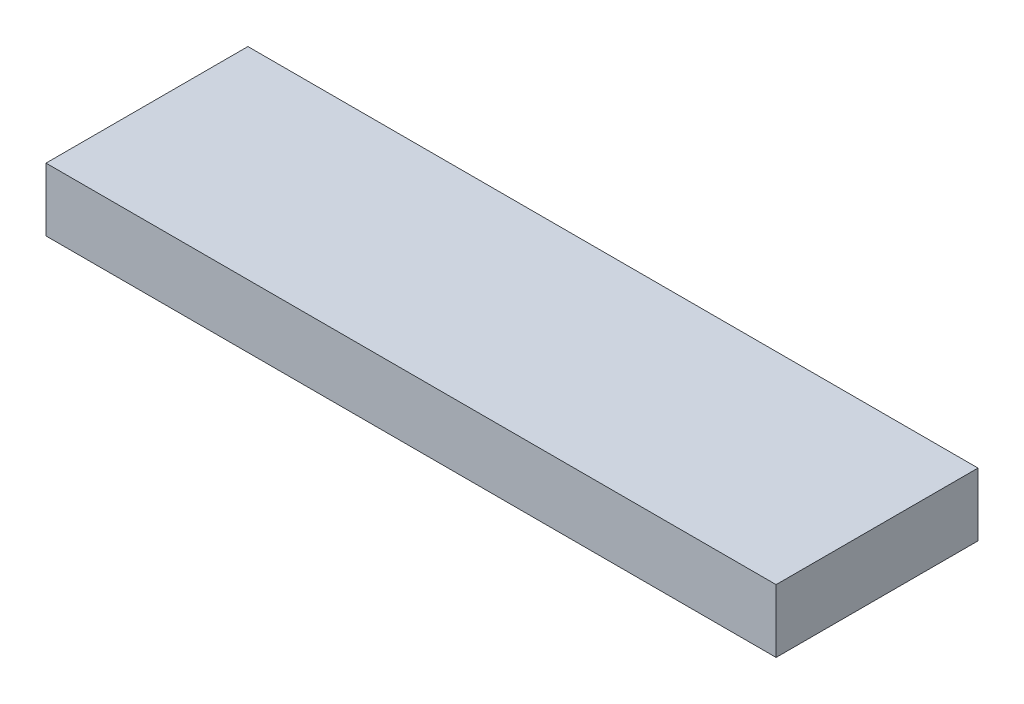
ISO-10303-21;
HEADER;
FILE_DESCRIPTION(('STEP AP214'),'2;1');
FILE_NAME('part.step','',(''),(''),'','','');
FILE_SCHEMA(('AUTOMOTIVE_DESIGN { 1 0 10303 214 1 1 1 1 }'));
ENDSEC;
DATA;
#1=APPLICATION_CONTEXT('core data for automotive mechanical design processes');
#2=APPLICATION_PROTOCOL_DEFINITION('international standard','automotive_design',2000,#1);
#3=PRODUCT_CONTEXT('',#1,'mechanical');
#4=PRODUCT('Part','Part','',(#3));
#5=PRODUCT_RELATED_PRODUCT_CATEGORY('part','',(#4));
#6=PRODUCT_DEFINITION_FORMATION('','',#4);
#7=PRODUCT_DEFINITION_CONTEXT('part definition',#1,'design');
#8=PRODUCT_DEFINITION('design','',#6,#7);
#9=PRODUCT_DEFINITION_SHAPE('','',#8);
#10=(LENGTH_UNIT() NAMED_UNIT(*) SI_UNIT(.MILLI.,.METRE.));
#11=(NAMED_UNIT(*) PLANE_ANGLE_UNIT() SI_UNIT($,.RADIAN.));
#12=(NAMED_UNIT(*) SI_UNIT($,.STERADIAN.) SOLID_ANGLE_UNIT());
#13=UNCERTAINTY_MEASURE_WITH_UNIT(LENGTH_MEASURE(1.E-05),#10,'distance_accuracy_value','');
#14=(GEOMETRIC_REPRESENTATION_CONTEXT(3) GLOBAL_UNCERTAINTY_ASSIGNED_CONTEXT((#13)) GLOBAL_UNIT_ASSIGNED_CONTEXT((#10,
#11,#12)) REPRESENTATION_CONTEXT('',''));
#15=CARTESIAN_POINT('',(0.,0.,0.));
#16=DIRECTION('',(0.,0.,1.));
#17=DIRECTION('',(1.,0.,0.));
#18=AXIS2_PLACEMENT_3D('',#15,#16,#17);
#19=CARTESIAN_POINT('',(-20.25,3.5,-5.6));
#20=DIRECTION('',(1.,0.,0.));
#21=DIRECTION('',(0.,0.,-1.));
#22=AXIS2_PLACEMENT_3D('',#19,#20,#21);
#23=PLANE('',#22);
#24=DIRECTION('',(0.,0.,1.));
#25=VECTOR('',#24,1.);
#26=CARTESIAN_POINT('',(-20.25,0.,-5.6));
#27=LINE('',#26,#25);
#28=CARTESIAN_POINT('',(-20.25,0.,-5.6));
#29=VERTEX_POINT('',#28);
#30=CARTESIAN_POINT('',(-20.25,0.,5.6));
#31=VERTEX_POINT('',#30);
#32=EDGE_CURVE('E98',#29,#31,#27,.T.);
#33=ORIENTED_EDGE('',*,*,#32,.T.);
#34=DIRECTION('',(0.,-1.,0.));
#35=VECTOR('',#34,1.);
#36=CARTESIAN_POINT('',(-20.25,3.5,5.6));
#37=LINE('',#36,#35);
#38=CARTESIAN_POINT('',(-20.25,3.5,5.6));
#39=VERTEX_POINT('',#38);
#40=EDGE_CURVE('E11',#39,#31,#37,.T.);
#41=ORIENTED_EDGE('',*,*,#40,.F.);
#42=DIRECTION('',(0.,0.,1.));
#43=VECTOR('',#42,1.);
#44=CARTESIAN_POINT('',(-20.25,3.5,-5.6));
#45=LINE('',#44,#43);
#46=CARTESIAN_POINT('',(-20.25,3.5,-5.6));
#47=VERTEX_POINT('',#46);
#48=EDGE_CURVE('E86',#47,#39,#45,.T.);
#49=ORIENTED_EDGE('',*,*,#48,.F.);
#50=DIRECTION('',(0.,-1.,0.));
#51=VECTOR('',#50,1.);
#52=CARTESIAN_POINT('',(-20.25,3.5,-5.6));
#53=LINE('',#52,#51);
#54=EDGE_CURVE('E94',#47,#29,#53,.T.);
#55=ORIENTED_EDGE('',*,*,#54,.T.);
#56=EDGE_LOOP('',(#33,#41,#49,#55));
#57=FACE_BOUND('',#56,.T.);
#58=ADVANCED_FACE('F35',(#57),#23,.F.);
#59=CARTESIAN_POINT('',(20.25,3.5,5.6));
#60=DIRECTION('',(0.,0.,-1.));
#61=DIRECTION('',(-1.,0.,0.));
#62=AXIS2_PLACEMENT_3D('',#59,#60,#61);
#63=PLANE('',#62);
#64=DIRECTION('',(1.,0.,0.));
#65=VECTOR('',#64,1.);
#66=CARTESIAN_POINT('',(20.25,0.,5.6));
#67=LINE('',#66,#65);
#68=CARTESIAN_POINT('',(20.25,0.,5.6));
#69=VERTEX_POINT('',#68);
#70=EDGE_CURVE('E90',#31,#69,#67,.T.);
#71=ORIENTED_EDGE('',*,*,#70,.T.);
#72=DIRECTION('',(0.,-1.,0.));
#73=VECTOR('',#72,1.);
#74=CARTESIAN_POINT('',(20.25,3.5,5.6));
#75=LINE('',#74,#73);
#76=CARTESIAN_POINT('',(20.25,3.5,5.6));
#77=VERTEX_POINT('',#76);
#78=EDGE_CURVE('E43',#77,#69,#75,.T.);
#79=ORIENTED_EDGE('',*,*,#78,.F.);
#80=DIRECTION('',(1.,0.,0.));
#81=VECTOR('',#80,1.);
#82=CARTESIAN_POINT('',(20.25,3.5,5.6));
#83=LINE('',#82,#81);
#84=EDGE_CURVE('E81',#39,#77,#83,.T.);
#85=ORIENTED_EDGE('',*,*,#84,.F.);
#86=ORIENTED_EDGE('',*,*,#40,.T.);
#87=EDGE_LOOP('',(#71,#79,#85,#86));
#88=FACE_BOUND('',#87,.T.);
#89=ADVANCED_FACE('F89',(#88),#63,.F.);
#90=CARTESIAN_POINT('',(20.25,3.5,-5.6));
#91=DIRECTION('',(-1.,0.,0.));
#92=DIRECTION('',(0.,0.,1.));
#93=AXIS2_PLACEMENT_3D('',#90,#91,#92);
#94=PLANE('',#93);
#95=DIRECTION('',(0.,0.,-1.));
#96=VECTOR('',#95,1.);
#97=CARTESIAN_POINT('',(20.25,0.,-5.6));
#98=LINE('',#97,#96);
#99=CARTESIAN_POINT('',(20.25,0.,-5.6));
#100=VERTEX_POINT('',#99);
#101=EDGE_CURVE('E68',#69,#100,#98,.T.);
#102=ORIENTED_EDGE('',*,*,#101,.T.);
#103=DIRECTION('',(0.,-1.,0.));
#104=VECTOR('',#103,1.);
#105=CARTESIAN_POINT('',(20.25,3.5,-5.6));
#106=LINE('',#105,#104);
#107=CARTESIAN_POINT('',(20.25,3.5,-5.6));
#108=VERTEX_POINT('',#107);
#109=EDGE_CURVE('E91',#108,#100,#106,.T.);
#110=ORIENTED_EDGE('',*,*,#109,.F.);
#111=DIRECTION('',(0.,0.,-1.));
#112=VECTOR('',#111,1.);
#113=CARTESIAN_POINT('',(20.25,3.5,-5.6));
#114=LINE('',#113,#112);
#115=EDGE_CURVE('E84',#77,#108,#114,.T.);
#116=ORIENTED_EDGE('',*,*,#115,.F.);
#117=ORIENTED_EDGE('',*,*,#78,.T.);
#118=EDGE_LOOP('',(#102,#110,#116,#117));
#119=FACE_BOUND('',#118,.T.);
#120=ADVANCED_FACE('F92',(#119),#94,.F.);
#121=CARTESIAN_POINT('',(20.25,3.5,-5.6));
#122=DIRECTION('',(0.,0.,1.));
#123=DIRECTION('',(1.,0.,0.));
#124=AXIS2_PLACEMENT_3D('',#121,#122,#123);
#125=PLANE('',#124);
#126=DIRECTION('',(-1.,0.,0.));
#127=VECTOR('',#126,1.);
#128=CARTESIAN_POINT('',(20.25,0.,-5.6));
#129=LINE('',#128,#127);
#130=EDGE_CURVE('E74',#100,#29,#129,.T.);
#131=ORIENTED_EDGE('',*,*,#130,.T.);
#132=ORIENTED_EDGE('',*,*,#54,.F.);
#133=DIRECTION('',(-1.,0.,0.));
#134=VECTOR('',#133,1.);
#135=CARTESIAN_POINT('',(20.25,3.5,-5.6));
#136=LINE('',#135,#134);
#137=EDGE_CURVE('E51',#108,#47,#136,.T.);
#138=ORIENTED_EDGE('',*,*,#137,.F.);
#139=ORIENTED_EDGE('',*,*,#109,.T.);
#140=EDGE_LOOP('',(#131,#132,#138,#139));
#141=FACE_BOUND('',#140,.T.);
#142=ADVANCED_FACE('F105',(#141),#125,.F.);
#143=CARTESIAN_POINT('',(0.,3.5,0.));
#144=DIRECTION('',(0.,-1.,0.));
#145=DIRECTION('',(0.,0.,-1.));
#146=AXIS2_PLACEMENT_3D('',#143,#144,#145);
#147=PLANE('',#146);
#148=ORIENTED_EDGE('',*,*,#48,.T.);
#149=ORIENTED_EDGE('',*,*,#84,.T.);
#150=ORIENTED_EDGE('',*,*,#115,.T.);
#151=ORIENTED_EDGE('',*,*,#137,.T.);
#152=EDGE_LOOP('',(#148,#149,#150,#151));
#153=FACE_BOUND('',#152,.T.);
#154=ADVANCED_FACE('F82',(#153),#147,.F.);
#155=CARTESIAN_POINT('',(0.,0.,0.));
#156=DIRECTION('',(0.,-1.,0.));
#157=DIRECTION('',(0.,0.,-1.));
#158=AXIS2_PLACEMENT_3D('',#155,#156,#157);
#159=PLANE('',#158);
#160=ORIENTED_EDGE('',*,*,#32,.F.);
#161=ORIENTED_EDGE('',*,*,#130,.F.);
#162=ORIENTED_EDGE('',*,*,#101,.F.);
#163=ORIENTED_EDGE('',*,*,#70,.F.);
#164=EDGE_LOOP('',(#160,#161,#162,#163));
#165=FACE_BOUND('',#164,.T.);
#166=ADVANCED_FACE('F108',(#165),#159,.T.);
#167=CLOSED_SHELL('',(#58,#89,#120,#142,#154,#166));
#168=MANIFOLD_SOLID_BREP('B2',#167);
#169=ADVANCED_BREP_SHAPE_REPRESENTATION('',(#18,#168),#14);
#170=SHAPE_DEFINITION_REPRESENTATION(#9,#169);
ENDSEC;
END-ISO-10303-21;
